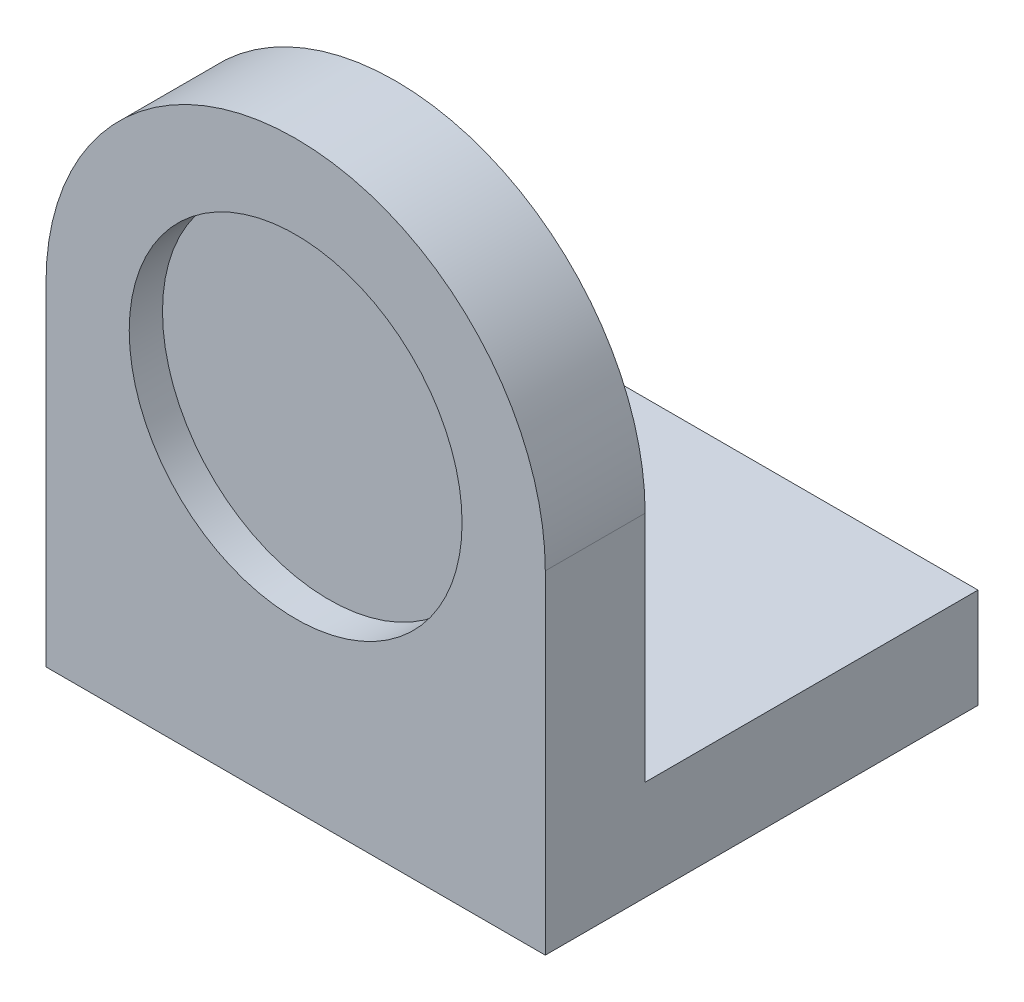
ISO-10303-21;
HEADER;
FILE_DESCRIPTION(('STEP AP214'),'2;1');
FILE_NAME('part.step','',(''),(''),'','','');
FILE_SCHEMA(('AUTOMOTIVE_DESIGN { 1 0 10303 214 1 1 1 1 }'));
ENDSEC;
DATA;
#1=APPLICATION_CONTEXT('core data for automotive mechanical design processes');
#2=APPLICATION_PROTOCOL_DEFINITION('international standard','automotive_design',2000,#1);
#3=PRODUCT_CONTEXT('',#1,'mechanical');
#4=PRODUCT('Part','Part','',(#3));
#5=PRODUCT_RELATED_PRODUCT_CATEGORY('part','',(#4));
#6=PRODUCT_DEFINITION_FORMATION('','',#4);
#7=PRODUCT_DEFINITION_CONTEXT('part definition',#1,'design');
#8=PRODUCT_DEFINITION('design','',#6,#7);
#9=PRODUCT_DEFINITION_SHAPE('','',#8);
#10=(LENGTH_UNIT() NAMED_UNIT(*) SI_UNIT(.MILLI.,.METRE.));
#11=(NAMED_UNIT(*) PLANE_ANGLE_UNIT() SI_UNIT($,.RADIAN.));
#12=(NAMED_UNIT(*) SI_UNIT($,.STERADIAN.) SOLID_ANGLE_UNIT());
#13=UNCERTAINTY_MEASURE_WITH_UNIT(LENGTH_MEASURE(1.E-05),#10,'distance_accuracy_value','');
#14=(GEOMETRIC_REPRESENTATION_CONTEXT(3) GLOBAL_UNCERTAINTY_ASSIGNED_CONTEXT((#13)) GLOBAL_UNIT_ASSIGNED_CONTEXT((#10,
#11,#12)) REPRESENTATION_CONTEXT('',''));
#15=CARTESIAN_POINT('',(0.,0.,0.));
#16=DIRECTION('',(0.,0.,1.));
#17=DIRECTION('',(1.,0.,0.));
#18=AXIS2_PLACEMENT_3D('',#15,#16,#17);
#19=CARTESIAN_POINT('',(0.,0.,0.));
#20=DIRECTION('',(0.,0.,1.));
#21=DIRECTION('',(1.,0.,0.));
#22=AXIS2_PLACEMENT_3D('',#19,#20,#21);
#23=PLANE('',#22);
#24=DIRECTION('',(1.,0.,0.));
#25=VECTOR('',#24,1.);
#26=CARTESIAN_POINT('',(7.5,-7.,0.));
#27=LINE('',#26,#25);
#28=CARTESIAN_POINT('',(-7.5,-7.,0.));
#29=VERTEX_POINT('',#28);
#30=CARTESIAN_POINT('',(7.5,-7.,0.));
#31=VERTEX_POINT('',#30);
#32=EDGE_CURVE('E48',#29,#31,#27,.T.);
#33=ORIENTED_EDGE('',*,*,#32,.F.);
#34=DIRECTION('',(0.,-1.,0.));
#35=VECTOR('',#34,1.);
#36=CARTESIAN_POINT('',(-7.5,0.,0.));
#37=LINE('',#36,#35);
#38=CARTESIAN_POINT('',(-7.5,0.,0.));
#39=VERTEX_POINT('',#38);
#40=EDGE_CURVE('E138',#39,#29,#37,.T.);
#41=ORIENTED_EDGE('',*,*,#40,.F.);
#42=CARTESIAN_POINT('',(0.,0.,0.));
#43=DIRECTION('',(0.,0.,1.));
#44=DIRECTION('',(1.,0.,0.));
#45=AXIS2_PLACEMENT_3D('',#42,#43,#44);
#46=CIRCLE('',#45,7.5);
#47=CARTESIAN_POINT('',(7.5,0.,0.));
#48=VERTEX_POINT('',#47);
#49=EDGE_CURVE('E129',#48,#39,#46,.T.);
#50=ORIENTED_EDGE('',*,*,#49,.F.);
#51=DIRECTION('',(0.,1.,0.));
#52=VECTOR('',#51,1.);
#53=CARTESIAN_POINT('',(7.5,-10.,0.));
#54=LINE('',#53,#52);
#55=EDGE_CURVE('E70',#31,#48,#54,.T.);
#56=ORIENTED_EDGE('',*,*,#55,.F.);
#57=EDGE_LOOP('',(#33,#41,#50,#56));
#58=FACE_BOUND('',#57,.T.);
#59=ADVANCED_FACE('F33',(#58),#23,.F.);
#60=CARTESIAN_POINT('',(0.,0.,3.));
#61=DIRECTION('',(0.,0.,-1.));
#62=DIRECTION('',(-1.,0.,0.));
#63=AXIS2_PLACEMENT_3D('',#60,#61,#62);
#64=CYLINDRICAL_SURFACE('',#63,5.);
#65=CARTESIAN_POINT('',(0.,0.,3.));
#66=DIRECTION('',(0.,0.,1.));
#67=DIRECTION('',(1.,0.,0.));
#68=AXIS2_PLACEMENT_3D('',#65,#66,#67);
#69=CIRCLE('',#68,5.);
#70=CARTESIAN_POINT('',(5.,0.,3.));
#71=VERTEX_POINT('',#70);
#72=EDGE_CURVE('E126',#71,#71,#69,.T.);
#73=ORIENTED_EDGE('',*,*,#72,.T.);
#74=EDGE_LOOP('',(#73));
#75=FACE_BOUND('',#74,.T.);
#76=CARTESIAN_POINT('',(0.,0.,2.));
#77=DIRECTION('',(0.,0.,-1.));
#78=DIRECTION('',(-1.,0.,0.));
#79=AXIS2_PLACEMENT_3D('',#76,#77,#78);
#80=CIRCLE('',#79,5.);
#81=CARTESIAN_POINT('',(-5.,0.,2.));
#82=VERTEX_POINT('',#81);
#83=EDGE_CURVE('E123',#82,#82,#80,.T.);
#84=ORIENTED_EDGE('',*,*,#83,.T.);
#85=EDGE_LOOP('',(#84));
#86=FACE_BOUND('',#85,.T.);
#87=ADVANCED_FACE('F155',(#75,#86),#64,.F.);
#88=CARTESIAN_POINT('',(0.,0.,3.));
#89=DIRECTION('',(0.,0.,1.));
#90=DIRECTION('',(1.,0.,0.));
#91=AXIS2_PLACEMENT_3D('',#88,#89,#90);
#92=PLANE('',#91);
#93=CARTESIAN_POINT('',(0.,0.,3.));
#94=DIRECTION('',(0.,0.,1.));
#95=DIRECTION('',(1.,0.,0.));
#96=AXIS2_PLACEMENT_3D('',#93,#94,#95);
#97=CIRCLE('',#96,7.5);
#98=CARTESIAN_POINT('',(7.5,0.,3.));
#99=VERTEX_POINT('',#98);
#100=CARTESIAN_POINT('',(-7.5,0.,3.));
#101=VERTEX_POINT('',#100);
#102=EDGE_CURVE('E130',#99,#101,#97,.T.);
#103=ORIENTED_EDGE('',*,*,#102,.T.);
#104=DIRECTION('',(0.,-1.,0.));
#105=VECTOR('',#104,1.);
#106=CARTESIAN_POINT('',(-7.5,0.,3.));
#107=LINE('',#106,#105);
#108=CARTESIAN_POINT('',(-7.5,-10.,3.));
#109=VERTEX_POINT('',#108);
#110=EDGE_CURVE('E77',#101,#109,#107,.T.);
#111=ORIENTED_EDGE('',*,*,#110,.T.);
#112=DIRECTION('',(1.,0.,0.));
#113=VECTOR('',#112,1.);
#114=CARTESIAN_POINT('',(-7.5,-10.,3.));
#115=LINE('',#114,#113);
#116=CARTESIAN_POINT('',(7.5,-10.,3.));
#117=VERTEX_POINT('',#116);
#118=EDGE_CURVE('E133',#109,#117,#115,.T.);
#119=ORIENTED_EDGE('',*,*,#118,.T.);
#120=DIRECTION('',(0.,1.,0.));
#121=VECTOR('',#120,1.);
#122=CARTESIAN_POINT('',(7.5,-10.,3.));
#123=LINE('',#122,#121);
#124=EDGE_CURVE('E57',#117,#99,#123,.T.);
#125=ORIENTED_EDGE('',*,*,#124,.T.);
#126=EDGE_LOOP('',(#103,#111,#119,#125));
#127=FACE_BOUND('',#126,.T.);
#128=ORIENTED_EDGE('',*,*,#72,.F.);
#129=EDGE_LOOP('',(#128));
#130=FACE_BOUND('',#129,.T.);
#131=ADVANCED_FACE('F153',(#127,#130),#92,.T.);
#132=CARTESIAN_POINT('',(0.,0.,3.));
#133=DIRECTION('',(0.,0.,-1.));
#134=DIRECTION('',(-1.,0.,0.));
#135=AXIS2_PLACEMENT_3D('',#132,#133,#134);
#136=CYLINDRICAL_SURFACE('',#135,7.5);
#137=ORIENTED_EDGE('',*,*,#49,.T.);
#138=DIRECTION('',(0.,0.,-1.));
#139=VECTOR('',#138,1.);
#140=CARTESIAN_POINT('',(-7.5,0.,3.));
#141=LINE('',#140,#139);
#142=EDGE_CURVE('E11',#101,#39,#141,.T.);
#143=ORIENTED_EDGE('',*,*,#142,.F.);
#144=ORIENTED_EDGE('',*,*,#102,.F.);
#145=DIRECTION('',(0.,0.,-1.));
#146=VECTOR('',#145,1.);
#147=CARTESIAN_POINT('',(7.5,0.,3.));
#148=LINE('',#147,#146);
#149=EDGE_CURVE('E100',#99,#48,#148,.T.);
#150=ORIENTED_EDGE('',*,*,#149,.T.);
#151=EDGE_LOOP('',(#137,#143,#144,#150));
#152=FACE_BOUND('',#151,.T.);
#153=ADVANCED_FACE('F35',(#152),#136,.T.);
#154=CARTESIAN_POINT('',(-7.5,0.,3.));
#155=DIRECTION('',(1.,0.,0.));
#156=DIRECTION('',(0.,1.,0.));
#157=AXIS2_PLACEMENT_3D('',#154,#155,#156);
#158=PLANE('',#157);
#159=ORIENTED_EDGE('',*,*,#40,.T.);
#160=DIRECTION('',(0.,0.,1.));
#161=VECTOR('',#160,1.);
#162=CARTESIAN_POINT('',(-7.5,-7.,-10.));
#163=LINE('',#162,#161);
#164=CARTESIAN_POINT('',(-7.5,-7.,-10.));
#165=VERTEX_POINT('',#164);
#166=EDGE_CURVE('E120',#165,#29,#163,.T.);
#167=ORIENTED_EDGE('',*,*,#166,.F.);
#168=DIRECTION('',(0.,1.,0.));
#169=VECTOR('',#168,1.);
#170=CARTESIAN_POINT('',(-7.5,-10.,-10.));
#171=LINE('',#170,#169);
#172=CARTESIAN_POINT('',(-7.5,-10.,-10.));
#173=VERTEX_POINT('',#172);
#174=EDGE_CURVE('E107',#173,#165,#171,.T.);
#175=ORIENTED_EDGE('',*,*,#174,.F.);
#176=DIRECTION('',(0.,0.,-1.));
#177=VECTOR('',#176,1.);
#178=CARTESIAN_POINT('',(-7.5,-10.,3.));
#179=LINE('',#178,#177);
#180=EDGE_CURVE('E41',#109,#173,#179,.T.);
#181=ORIENTED_EDGE('',*,*,#180,.F.);
#182=ORIENTED_EDGE('',*,*,#110,.F.);
#183=ORIENTED_EDGE('',*,*,#142,.T.);
#184=EDGE_LOOP('',(#159,#167,#175,#181,#182,#183));
#185=FACE_BOUND('',#184,.T.);
#186=ADVANCED_FACE('F146',(#185),#158,.F.);
#187=CARTESIAN_POINT('',(-7.5,-10.,3.));
#188=DIRECTION('',(0.,1.,0.));
#189=DIRECTION('',(0.,0.,1.));
#190=AXIS2_PLACEMENT_3D('',#187,#188,#189);
#191=PLANE('',#190);
#192=ORIENTED_EDGE('',*,*,#180,.T.);
#193=DIRECTION('',(-1.,0.,0.));
#194=VECTOR('',#193,1.);
#195=CARTESIAN_POINT('',(7.5,-10.,-10.));
#196=LINE('',#195,#194);
#197=CARTESIAN_POINT('',(7.5,-10.,-10.));
#198=VERTEX_POINT('',#197);
#199=EDGE_CURVE('E103',#198,#173,#196,.T.);
#200=ORIENTED_EDGE('',*,*,#199,.F.);
#201=DIRECTION('',(0.,0.,-1.));
#202=VECTOR('',#201,1.);
#203=CARTESIAN_POINT('',(7.5,-10.,3.));
#204=LINE('',#203,#202);
#205=EDGE_CURVE('E93',#117,#198,#204,.T.);
#206=ORIENTED_EDGE('',*,*,#205,.F.);
#207=ORIENTED_EDGE('',*,*,#118,.F.);
#208=EDGE_LOOP('',(#192,#200,#206,#207));
#209=FACE_BOUND('',#208,.T.);
#210=ADVANCED_FACE('F104',(#209),#191,.F.);
#211=CARTESIAN_POINT('',(7.5,-10.,3.));
#212=DIRECTION('',(-1.,0.,0.));
#213=DIRECTION('',(0.,-1.,0.));
#214=AXIS2_PLACEMENT_3D('',#211,#212,#213);
#215=PLANE('',#214);
#216=ORIENTED_EDGE('',*,*,#205,.T.);
#217=DIRECTION('',(0.,-1.,0.));
#218=VECTOR('',#217,1.);
#219=CARTESIAN_POINT('',(7.5,-10.,-10.));
#220=LINE('',#219,#218);
#221=CARTESIAN_POINT('',(7.5,-7.,-10.));
#222=VERTEX_POINT('',#221);
#223=EDGE_CURVE('E97',#222,#198,#220,.T.);
#224=ORIENTED_EDGE('',*,*,#223,.F.);
#225=DIRECTION('',(0.,0.,1.));
#226=VECTOR('',#225,1.);
#227=CARTESIAN_POINT('',(7.5,-7.,-10.));
#228=LINE('',#227,#226);
#229=EDGE_CURVE('E117',#222,#31,#228,.T.);
#230=ORIENTED_EDGE('',*,*,#229,.T.);
#231=ORIENTED_EDGE('',*,*,#55,.T.);
#232=ORIENTED_EDGE('',*,*,#149,.F.);
#233=ORIENTED_EDGE('',*,*,#124,.F.);
#234=EDGE_LOOP('',(#216,#224,#230,#231,#232,#233));
#235=FACE_BOUND('',#234,.T.);
#236=ADVANCED_FACE('F95',(#235),#215,.F.);
#237=CARTESIAN_POINT('',(0.,0.,2.));
#238=DIRECTION('',(0.,0.,-1.));
#239=DIRECTION('',(-1.,0.,0.));
#240=AXIS2_PLACEMENT_3D('',#237,#238,#239);
#241=PLANE('',#240);
#242=ORIENTED_EDGE('',*,*,#83,.F.);
#243=EDGE_LOOP('',(#242));
#244=FACE_BOUND('',#243,.T.);
#245=ADVANCED_FACE('F165',(#244),#241,.F.);
#246=CARTESIAN_POINT('',(7.5,-7.,-10.));
#247=DIRECTION('',(0.,-1.,0.));
#248=DIRECTION('',(0.,0.,-1.));
#249=AXIS2_PLACEMENT_3D('',#246,#247,#248);
#250=PLANE('',#249);
#251=ORIENTED_EDGE('',*,*,#32,.T.);
#252=ORIENTED_EDGE('',*,*,#229,.F.);
#253=DIRECTION('',(1.,0.,0.));
#254=VECTOR('',#253,1.);
#255=CARTESIAN_POINT('',(7.5,-7.,-10.));
#256=LINE('',#255,#254);
#257=EDGE_CURVE('E111',#165,#222,#256,.T.);
#258=ORIENTED_EDGE('',*,*,#257,.F.);
#259=ORIENTED_EDGE('',*,*,#166,.T.);
#260=EDGE_LOOP('',(#251,#252,#258,#259));
#261=FACE_BOUND('',#260,.T.);
#262=ADVANCED_FACE('F169',(#261),#250,.F.);
#263=CARTESIAN_POINT('',(0.,0.,-10.));
#264=DIRECTION('',(0.,0.,1.));
#265=DIRECTION('',(1.,0.,0.));
#266=AXIS2_PLACEMENT_3D('',#263,#264,#265);
#267=PLANE('',#266);
#268=ORIENTED_EDGE('',*,*,#223,.T.);
#269=ORIENTED_EDGE('',*,*,#199,.T.);
#270=ORIENTED_EDGE('',*,*,#174,.T.);
#271=ORIENTED_EDGE('',*,*,#257,.T.);
#272=EDGE_LOOP('',(#268,#269,#270,#271));
#273=FACE_BOUND('',#272,.T.);
#274=ADVANCED_FACE('F109',(#273),#267,.F.);
#275=CLOSED_SHELL('',(#59,#87,#131,#153,#186,#210,#236,#245,#262,#274));
#276=MANIFOLD_SOLID_BREP('B2',#275);
#277=ADVANCED_BREP_SHAPE_REPRESENTATION('',(#18,#276),#14);
#278=SHAPE_DEFINITION_REPRESENTATION(#9,#277);
ENDSEC;
END-ISO-10303-21;
